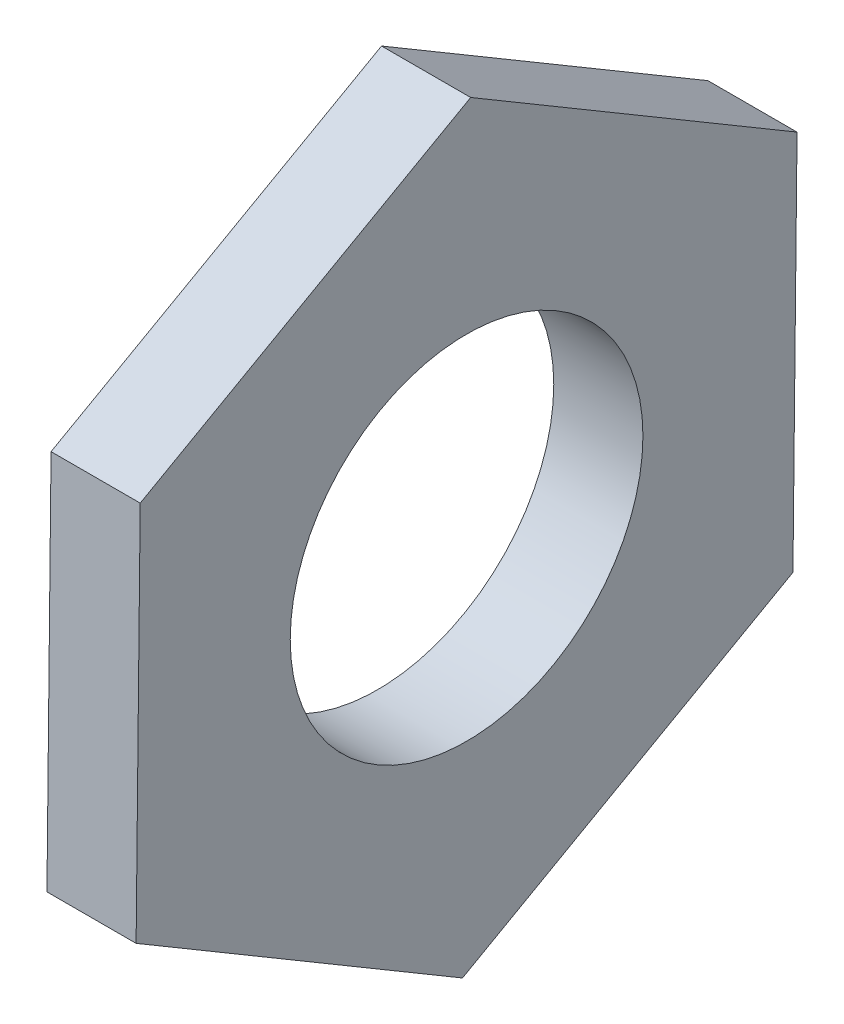
ISO-10303-21;
HEADER;
FILE_DESCRIPTION(('STEP AP214'),'2;1');
FILE_NAME('part.step','',(''),(''),'','','');
FILE_SCHEMA(('AUTOMOTIVE_DESIGN { 1 0 10303 214 1 1 1 1 }'));
ENDSEC;
DATA;
#1=APPLICATION_CONTEXT('core data for automotive mechanical design processes');
#2=APPLICATION_PROTOCOL_DEFINITION('international standard','automotive_design',2000,#1);
#3=PRODUCT_CONTEXT('',#1,'mechanical');
#4=PRODUCT('Part','Part','',(#3));
#5=PRODUCT_RELATED_PRODUCT_CATEGORY('part','',(#4));
#6=PRODUCT_DEFINITION_FORMATION('','',#4);
#7=PRODUCT_DEFINITION_CONTEXT('part definition',#1,'design');
#8=PRODUCT_DEFINITION('design','',#6,#7);
#9=PRODUCT_DEFINITION_SHAPE('','',#8);
#10=(LENGTH_UNIT() NAMED_UNIT(*) SI_UNIT(.MILLI.,.METRE.));
#11=(NAMED_UNIT(*) PLANE_ANGLE_UNIT() SI_UNIT($,.RADIAN.));
#12=(NAMED_UNIT(*) SI_UNIT($,.STERADIAN.) SOLID_ANGLE_UNIT());
#13=UNCERTAINTY_MEASURE_WITH_UNIT(LENGTH_MEASURE(1.E-05),#10,'distance_accuracy_value','');
#14=(GEOMETRIC_REPRESENTATION_CONTEXT(3) GLOBAL_UNCERTAINTY_ASSIGNED_CONTEXT((#13)) GLOBAL_UNIT_ASSIGNED_CONTEXT((#10,
#11,#12)) REPRESENTATION_CONTEXT('',''));
#15=CARTESIAN_POINT('',(0.,0.,0.));
#16=DIRECTION('',(0.,0.,1.));
#17=DIRECTION('',(1.,0.,0.));
#18=AXIS2_PLACEMENT_3D('',#15,#16,#17);
#19=CARTESIAN_POINT('',(12.7,27.5144132208375,46.4870387712863));
#20=DIRECTION('',(0.,-0.0108231898541319,-0.999941427565326));
#21=DIRECTION('',(0.,0.999941427565326,-0.0108231898541319));
#22=AXIS2_PLACEMENT_3D('',#19,#20,#21);
#23=PLANE('',#22);
#24=DIRECTION('',(0.,-0.999941427565326,0.0108231898541319));
#25=VECTOR('',#24,1.);
#26=CARTESIAN_POINT('',(0.,27.5144132208375,46.4870387712863));
#27=LINE('',#26,#25);
#28=CARTESIAN_POINT('',(0.,27.5144132208375,46.4870387712863));
#29=VERTEX_POINT('',#28);
#30=CARTESIAN_POINT('',(0.,-26.5017499122273,47.0717002051109));
#31=VERTEX_POINT('',#30);
#32=EDGE_CURVE('E128',#29,#31,#27,.T.);
#33=ORIENTED_EDGE('',*,*,#32,.T.);
#34=DIRECTION('',(-1.,0.,0.));
#35=VECTOR('',#34,1.);
#36=CARTESIAN_POINT('',(12.7,-26.5017499122273,47.0717002051109));
#37=LINE('',#36,#35);
#38=CARTESIAN_POINT('',(12.7,-26.5017499122273,47.0717002051109));
#39=VERTEX_POINT('',#38);
#40=EDGE_CURVE('E11',#39,#31,#37,.T.);
#41=ORIENTED_EDGE('',*,*,#40,.F.);
#42=DIRECTION('',(0.,-0.999941427565326,0.0108231898541319));
#43=VECTOR('',#42,1.);
#44=CARTESIAN_POINT('',(12.7,27.5144132208375,46.4870387712863));
#45=LINE('',#44,#43);
#46=CARTESIAN_POINT('',(12.7,27.5144132208375,46.4870387712863));
#47=VERTEX_POINT('',#46);
#48=EDGE_CURVE('E145',#47,#39,#45,.T.);
#49=ORIENTED_EDGE('',*,*,#48,.F.);
#50=DIRECTION('',(-1.,0.,0.));
#51=VECTOR('',#50,1.);
#52=CARTESIAN_POINT('',(12.7,27.5144132208375,46.4870387712863));
#53=LINE('',#52,#51);
#54=EDGE_CURVE('E124',#47,#29,#53,.T.);
#55=ORIENTED_EDGE('',*,*,#54,.T.);
#56=EDGE_LOOP('',(#33,#41,#49,#55));
#57=FACE_BOUND('',#56,.T.);
#58=ADVANCED_FACE('F39',(#57),#23,.F.);
#59=CARTESIAN_POINT('',(12.7,-26.5017499122273,47.0717002051109));
#60=DIRECTION('',(0.,0.860563083640983,-0.509343871146324));
#61=DIRECTION('',(0.,0.509343871146324,0.860563083640983));
#62=AXIS2_PLACEMENT_3D('',#59,#60,#61);
#63=PLANE('',#62);
#64=DIRECTION('',(0.,-0.509343871146324,-0.860563083640983));
#65=VECTOR('',#64,1.);
#66=CARTESIAN_POINT('',(0.,-26.5017499122273,47.0717002051109));
#67=LINE('',#66,#65);
#68=CARTESIAN_POINT('',(0.,-54.0161631330649,0.584661433824562));
#69=VERTEX_POINT('',#68);
#70=EDGE_CURVE('E132',#31,#69,#67,.T.);
#71=ORIENTED_EDGE('',*,*,#70,.T.);
#72=DIRECTION('',(-1.,0.,0.));
#73=VECTOR('',#72,1.);
#74=CARTESIAN_POINT('',(12.7,-54.0161631330649,0.584661433824562));
#75=LINE('',#74,#73);
#76=CARTESIAN_POINT('',(12.7,-54.0161631330649,0.584661433824562));
#77=VERTEX_POINT('',#76);
#78=EDGE_CURVE('E48',#77,#69,#75,.T.);
#79=ORIENTED_EDGE('',*,*,#78,.F.);
#80=DIRECTION('',(0.,-0.509343871146324,-0.860563083640983));
#81=VECTOR('',#80,1.);
#82=CARTESIAN_POINT('',(12.7,-26.5017499122273,47.0717002051109));
#83=LINE('',#82,#81);
#84=EDGE_CURVE('E93',#39,#77,#83,.T.);
#85=ORIENTED_EDGE('',*,*,#84,.F.);
#86=ORIENTED_EDGE('',*,*,#40,.T.);
#87=EDGE_LOOP('',(#71,#79,#85,#86));
#88=FACE_BOUND('',#87,.T.);
#89=ADVANCED_FACE('F174',(#88),#63,.F.);
#90=CARTESIAN_POINT('',(12.7,-54.0161631330649,0.584661433824562));
#91=DIRECTION('',(0.,0.871386273495115,0.490597556419002));
#92=DIRECTION('',(0.,-0.490597556419002,0.871386273495115));
#93=AXIS2_PLACEMENT_3D('',#90,#91,#92);
#94=PLANE('',#93);
#95=DIRECTION('',(0.,0.490597556419002,-0.871386273495115));
#96=VECTOR('',#95,1.);
#97=CARTESIAN_POINT('',(0.,-54.0161631330649,0.584661433824562));
#98=LINE('',#97,#96);
#99=CARTESIAN_POINT('',(0.,-27.5144132208376,-46.4870387712863));
#100=VERTEX_POINT('',#99);
#101=EDGE_CURVE('E136',#69,#100,#98,.T.);
#102=ORIENTED_EDGE('',*,*,#101,.T.);
#103=DIRECTION('',(-1.,0.,0.));
#104=VECTOR('',#103,1.);
#105=CARTESIAN_POINT('',(12.7,-27.5144132208376,-46.4870387712863));
#106=LINE('',#105,#104);
#107=CARTESIAN_POINT('',(12.7,-27.5144132208376,-46.4870387712863));
#108=VERTEX_POINT('',#107);
#109=EDGE_CURVE('E117',#108,#100,#106,.T.);
#110=ORIENTED_EDGE('',*,*,#109,.F.);
#111=DIRECTION('',(0.,0.490597556419002,-0.871386273495115));
#112=VECTOR('',#111,1.);
#113=CARTESIAN_POINT('',(12.7,-54.0161631330649,0.584661433824562));
#114=LINE('',#113,#112);
#115=EDGE_CURVE('E106',#77,#108,#114,.T.);
#116=ORIENTED_EDGE('',*,*,#115,.F.);
#117=ORIENTED_EDGE('',*,*,#78,.T.);
#118=EDGE_LOOP('',(#102,#110,#116,#117));
#119=FACE_BOUND('',#118,.T.);
#120=ADVANCED_FACE('F155',(#119),#94,.F.);
#121=CARTESIAN_POINT('',(12.7,-27.5144132208376,-46.4870387712863));
#122=DIRECTION('',(0.,0.0108231898541316,0.999941427565326));
#123=DIRECTION('',(0.,-0.999941427565326,0.0108231898541316));
#124=AXIS2_PLACEMENT_3D('',#121,#122,#123);
#125=PLANE('',#124);
#126=DIRECTION('',(0.,0.999941427565326,-0.0108231898541316));
#127=VECTOR('',#126,1.);
#128=CARTESIAN_POINT('',(0.,-27.5144132208376,-46.4870387712863));
#129=LINE('',#128,#127);
#130=CARTESIAN_POINT('',(0.,26.5017499122273,-47.0717002051109));
#131=VERTEX_POINT('',#130);
#132=EDGE_CURVE('E115',#100,#131,#129,.T.);
#133=ORIENTED_EDGE('',*,*,#132,.T.);
#134=DIRECTION('',(-1.,0.,0.));
#135=VECTOR('',#134,1.);
#136=CARTESIAN_POINT('',(12.7,26.5017499122273,-47.0717002051109));
#137=LINE('',#136,#135);
#138=CARTESIAN_POINT('',(12.7,26.5017499122273,-47.0717002051109));
#139=VERTEX_POINT('',#138);
#140=EDGE_CURVE('E112',#139,#131,#137,.T.);
#141=ORIENTED_EDGE('',*,*,#140,.F.);
#142=DIRECTION('',(0.,0.999941427565326,-0.0108231898541316));
#143=VECTOR('',#142,1.);
#144=CARTESIAN_POINT('',(12.7,-27.5144132208376,-46.4870387712863));
#145=LINE('',#144,#143);
#146=EDGE_CURVE('E100',#108,#139,#145,.T.);
#147=ORIENTED_EDGE('',*,*,#146,.F.);
#148=ORIENTED_EDGE('',*,*,#109,.T.);
#149=EDGE_LOOP('',(#133,#141,#147,#148));
#150=FACE_BOUND('',#149,.T.);
#151=ADVANCED_FACE('F113',(#150),#125,.F.);
#152=CARTESIAN_POINT('',(12.7,26.5017499122273,-47.0717002051109));
#153=DIRECTION('',(0.,-0.860563083640983,0.509343871146324));
#154=DIRECTION('',(0.,-0.509343871146324,-0.860563083640983));
#155=AXIS2_PLACEMENT_3D('',#152,#153,#154);
#156=PLANE('',#155);
#157=DIRECTION('',(0.,0.509343871146324,0.860563083640983));
#158=VECTOR('',#157,1.);
#159=CARTESIAN_POINT('',(0.,26.5017499122273,-47.0717002051109));
#160=LINE('',#159,#158);
#161=CARTESIAN_POINT('',(0.,54.0161631330649,-0.584661433824579));
#162=VERTEX_POINT('',#161);
#163=EDGE_CURVE('E79',#131,#162,#160,.T.);
#164=ORIENTED_EDGE('',*,*,#163,.T.);
#165=DIRECTION('',(-1.,0.,0.));
#166=VECTOR('',#165,1.);
#167=CARTESIAN_POINT('',(12.7,54.0161631330649,-0.584661433824579));
#168=LINE('',#167,#166);
#169=CARTESIAN_POINT('',(12.7,54.0161631330649,-0.584661433824579));
#170=VERTEX_POINT('',#169);
#171=EDGE_CURVE('E118',#170,#162,#168,.T.);
#172=ORIENTED_EDGE('',*,*,#171,.F.);
#173=DIRECTION('',(0.,0.509343871146324,0.860563083640983));
#174=VECTOR('',#173,1.);
#175=CARTESIAN_POINT('',(12.7,26.5017499122273,-47.0717002051109));
#176=LINE('',#175,#174);
#177=EDGE_CURVE('E104',#139,#170,#176,.T.);
#178=ORIENTED_EDGE('',*,*,#177,.F.);
#179=ORIENTED_EDGE('',*,*,#140,.T.);
#180=EDGE_LOOP('',(#164,#172,#178,#179));
#181=FACE_BOUND('',#180,.T.);
#182=ADVANCED_FACE('F120',(#181),#156,.F.);
#183=CARTESIAN_POINT('',(12.7,54.0161631330649,-0.584661433824579));
#184=DIRECTION('',(0.,-0.871386273495115,-0.490597556419003));
#185=DIRECTION('',(0.,0.490597556419003,-0.871386273495115));
#186=AXIS2_PLACEMENT_3D('',#183,#184,#185);
#187=PLANE('',#186);
#188=DIRECTION('',(0.,-0.490597556419003,0.871386273495115));
#189=VECTOR('',#188,1.);
#190=CARTESIAN_POINT('',(0.,54.0161631330649,-0.584661433824579));
#191=LINE('',#190,#189);
#192=EDGE_CURVE('E85',#162,#29,#191,.T.);
#193=ORIENTED_EDGE('',*,*,#192,.T.);
#194=ORIENTED_EDGE('',*,*,#54,.F.);
#195=DIRECTION('',(0.,-0.490597556419003,0.871386273495115));
#196=VECTOR('',#195,1.);
#197=CARTESIAN_POINT('',(12.7,54.0161631330649,-0.584661433824579));
#198=LINE('',#197,#196);
#199=EDGE_CURVE('E56',#170,#47,#198,.T.);
#200=ORIENTED_EDGE('',*,*,#199,.F.);
#201=ORIENTED_EDGE('',*,*,#171,.T.);
#202=EDGE_LOOP('',(#193,#194,#200,#201));
#203=FACE_BOUND('',#202,.T.);
#204=ADVANCED_FACE('F162',(#203),#187,.F.);
#205=CARTESIAN_POINT('',(12.7,0.,0.));
#206=DIRECTION('',(1.,0.,0.));
#207=DIRECTION('',(0.,0.,-1.));
#208=AXIS2_PLACEMENT_3D('',#205,#206,#207);
#209=PLANE('',#208);
#210=CARTESIAN_POINT('',(12.7,0.,0.));
#211=DIRECTION('',(1.,0.,0.));
#212=DIRECTION('',(0.,0.,-1.));
#213=AXIS2_PLACEMENT_3D('',#210,#211,#212);
#214=CIRCLE('',#213,25.1203825513552);
#215=CARTESIAN_POINT('',(12.7,0.,-25.1203825513552));
#216=VERTEX_POINT('',#215);
#217=EDGE_CURVE('E133',#216,#216,#214,.T.);
#218=ORIENTED_EDGE('',*,*,#217,.F.);
#219=EDGE_LOOP('',(#218));
#220=FACE_BOUND('',#219,.T.);
#221=ORIENTED_EDGE('',*,*,#48,.T.);
#222=ORIENTED_EDGE('',*,*,#84,.T.);
#223=ORIENTED_EDGE('',*,*,#115,.T.);
#224=ORIENTED_EDGE('',*,*,#146,.T.);
#225=ORIENTED_EDGE('',*,*,#177,.T.);
#226=ORIENTED_EDGE('',*,*,#199,.T.);
#227=EDGE_LOOP('',(#221,#222,#223,#224,#225,#226));
#228=FACE_BOUND('',#227,.T.);
#229=ADVANCED_FACE('F102',(#220,#228),#209,.T.);
#230=CARTESIAN_POINT('',(0.,0.,0.));
#231=DIRECTION('',(1.,0.,0.));
#232=DIRECTION('',(0.,0.,-1.));
#233=AXIS2_PLACEMENT_3D('',#230,#231,#232);
#234=PLANE('',#233);
#235=CARTESIAN_POINT('',(0.,0.,0.));
#236=DIRECTION('',(1.,0.,0.));
#237=DIRECTION('',(0.,0.,-1.));
#238=AXIS2_PLACEMENT_3D('',#235,#236,#237);
#239=CIRCLE('',#238,25.1203825513552);
#240=CARTESIAN_POINT('',(0.,0.,-25.1203825513552));
#241=VERTEX_POINT('',#240);
#242=EDGE_CURVE('E229',#241,#241,#239,.T.);
#243=ORIENTED_EDGE('',*,*,#242,.T.);
#244=EDGE_LOOP('',(#243));
#245=FACE_BOUND('',#244,.T.);
#246=ORIENTED_EDGE('',*,*,#32,.F.);
#247=ORIENTED_EDGE('',*,*,#192,.F.);
#248=ORIENTED_EDGE('',*,*,#163,.F.);
#249=ORIENTED_EDGE('',*,*,#132,.F.);
#250=ORIENTED_EDGE('',*,*,#101,.F.);
#251=ORIENTED_EDGE('',*,*,#70,.F.);
#252=EDGE_LOOP('',(#246,#247,#248,#249,#250,#251));
#253=FACE_BOUND('',#252,.T.);
#254=ADVANCED_FACE('F158',(#245,#253),#234,.F.);
#255=CARTESIAN_POINT('',(0.,0.,0.));
#256=DIRECTION('',(1.,0.,0.));
#257=DIRECTION('',(0.,0.,-1.));
#258=AXIS2_PLACEMENT_3D('',#255,#256,#257);
#259=CYLINDRICAL_SURFACE('',#258,25.1203825513552);
#260=ORIENTED_EDGE('',*,*,#217,.T.);
#261=EDGE_LOOP('',(#260));
#262=FACE_BOUND('',#261,.T.);
#263=ORIENTED_EDGE('',*,*,#242,.F.);
#264=EDGE_LOOP('',(#263));
#265=FACE_BOUND('',#264,.T.);
#266=ADVANCED_FACE('F211',(#262,#265),#259,.F.);
#267=CLOSED_SHELL('',(#58,#89,#120,#151,#182,#204,#229,#254,#266));
#268=MANIFOLD_SOLID_BREP('B2',#267);
#269=ADVANCED_BREP_SHAPE_REPRESENTATION('',(#18,#268),#14);
#270=SHAPE_DEFINITION_REPRESENTATION(#9,#269);
ENDSEC;
END-ISO-10303-21;
